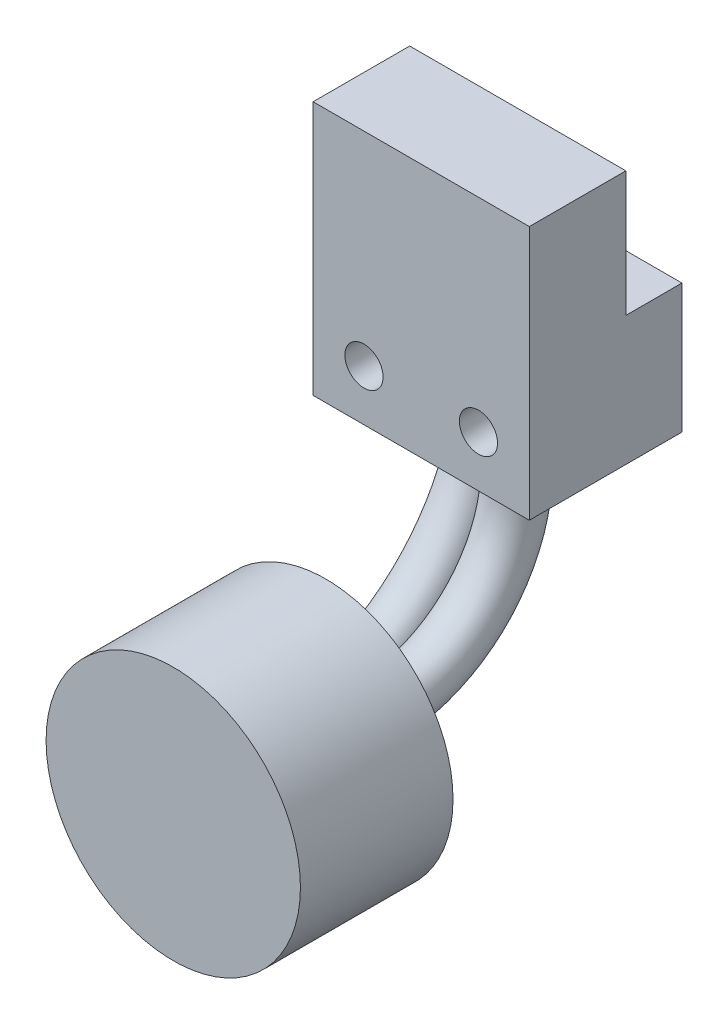
ISO-10303-21;
HEADER;
FILE_DESCRIPTION(('STEP AP214'),'2;1');
FILE_NAME('part.step','',(''),(''),'','','');
FILE_SCHEMA(('AUTOMOTIVE_DESIGN { 1 0 10303 214 1 1 1 1 }'));
ENDSEC;
DATA;
#1=APPLICATION_CONTEXT('core data for automotive mechanical design processes');
#2=APPLICATION_PROTOCOL_DEFINITION('international standard','automotive_design',2000,#1);
#3=PRODUCT_CONTEXT('',#1,'mechanical');
#4=PRODUCT('Part','Part','',(#3));
#5=PRODUCT_RELATED_PRODUCT_CATEGORY('part','',(#4));
#6=PRODUCT_DEFINITION_FORMATION('','',#4);
#7=PRODUCT_DEFINITION_CONTEXT('part definition',#1,'design');
#8=PRODUCT_DEFINITION('design','',#6,#7);
#9=PRODUCT_DEFINITION_SHAPE('','',#8);
#10=(LENGTH_UNIT() NAMED_UNIT(*) SI_UNIT(.MILLI.,.METRE.));
#11=(NAMED_UNIT(*) PLANE_ANGLE_UNIT() SI_UNIT($,.RADIAN.));
#12=(NAMED_UNIT(*) SI_UNIT($,.STERADIAN.) SOLID_ANGLE_UNIT());
#13=UNCERTAINTY_MEASURE_WITH_UNIT(LENGTH_MEASURE(1.E-05),#10,'distance_accuracy_value','');
#14=(GEOMETRIC_REPRESENTATION_CONTEXT(3) GLOBAL_UNCERTAINTY_ASSIGNED_CONTEXT((#13)) GLOBAL_UNIT_ASSIGNED_CONTEXT((#10,
#11,#12)) REPRESENTATION_CONTEXT('',''));
#15=CARTESIAN_POINT('',(0.,0.,0.));
#16=DIRECTION('',(0.,0.,1.));
#17=DIRECTION('',(1.,0.,0.));
#18=AXIS2_PLACEMENT_3D('',#15,#16,#17);
#19=CARTESIAN_POINT('',(0.,0.,60.));
#20=DIRECTION('',(0.,0.,-1.));
#21=DIRECTION('',(-1.,0.,0.));
#22=AXIS2_PLACEMENT_3D('',#19,#20,#21);
#23=CYLINDRICAL_SURFACE('',#22,50.);
#24=CARTESIAN_POINT('',(0.,0.,60.));
#25=DIRECTION('',(0.,0.,1.));
#26=DIRECTION('',(1.,0.,0.));
#27=AXIS2_PLACEMENT_3D('',#24,#25,#26);
#28=CIRCLE('',#27,50.);
#29=CARTESIAN_POINT('',(50.,0.,60.));
#30=VERTEX_POINT('',#29);
#31=EDGE_CURVE('E120',#30,#30,#28,.T.);
#32=ORIENTED_EDGE('',*,*,#31,.F.);
#33=EDGE_LOOP('',(#32));
#34=FACE_BOUND('',#33,.T.);
#35=CARTESIAN_POINT('',(0.,0.,0.));
#36=DIRECTION('',(0.,0.,1.));
#37=DIRECTION('',(1.,0.,0.));
#38=AXIS2_PLACEMENT_3D('',#35,#36,#37);
#39=CIRCLE('',#38,50.);
#40=CARTESIAN_POINT('',(50.,0.,0.));
#41=VERTEX_POINT('',#40);
#42=EDGE_CURVE('E119',#41,#41,#39,.T.);
#43=ORIENTED_EDGE('',*,*,#42,.T.);
#44=EDGE_LOOP('',(#43));
#45=FACE_BOUND('',#44,.T.);
#46=ADVANCED_FACE('F33',(#34,#45),#23,.T.);
#47=CARTESIAN_POINT('',(0.,0.,60.));
#48=DIRECTION('',(0.,0.,1.));
#49=DIRECTION('',(1.,0.,0.));
#50=AXIS2_PLACEMENT_3D('',#47,#48,#49);
#51=PLANE('',#50);
#52=ORIENTED_EDGE('',*,*,#31,.T.);
#53=EDGE_LOOP('',(#52));
#54=FACE_BOUND('',#53,.T.);
#55=ADVANCED_FACE('F136',(#54),#51,.T.);
#56=CARTESIAN_POINT('',(0.,0.,0.));
#57=DIRECTION('',(0.,0.,1.));
#58=DIRECTION('',(1.,0.,0.));
#59=AXIS2_PLACEMENT_3D('',#56,#57,#58);
#60=PLANE('',#59);
#61=CARTESIAN_POINT('',(20.,15.,0.));
#62=DIRECTION('',(0.,0.,1.));
#63=DIRECTION('',(1.,0.,0.));
#64=AXIS2_PLACEMENT_3D('',#61,#62,#63);
#65=CIRCLE('',#64,10.);
#66=CARTESIAN_POINT('',(20.,4.99999999999998,0.));
#67=VERTEX_POINT('',#66);
#68=EDGE_CURVE('E40',#67,#67,#65,.F.);
#69=ORIENTED_EDGE('',*,*,#68,.F.);
#70=EDGE_LOOP('',(#69));
#71=FACE_BOUND('',#70,.T.);
#72=CARTESIAN_POINT('',(-20.,-15.,0.));
#73=DIRECTION('',(0.,0.,1.));
#74=DIRECTION('',(1.,0.,0.));
#75=AXIS2_PLACEMENT_3D('',#72,#73,#74);
#76=CIRCLE('',#75,10.);
#77=CARTESIAN_POINT('',(-20.,-25.,0.));
#78=VERTEX_POINT('',#77);
#79=EDGE_CURVE('E123',#78,#78,#76,.F.);
#80=ORIENTED_EDGE('',*,*,#79,.F.);
#81=EDGE_LOOP('',(#80));
#82=FACE_BOUND('',#81,.T.);
#83=ORIENTED_EDGE('',*,*,#42,.F.);
#84=EDGE_LOOP('',(#83));
#85=FACE_BOUND('',#84,.T.);
#86=ADVANCED_FACE('F132',(#71,#82,#85),#60,.F.);
#87=CARTESIAN_POINT('',(-20.,70.,0.));
#88=DIRECTION('',(-1.,0.,0.));
#89=DIRECTION('',(0.,-1.,0.));
#90=AXIS2_PLACEMENT_3D('',#87,#88,#89);
#91=TOROIDAL_SURFACE('',#90,85.,10.);
#92=CARTESIAN_POINT('',(-20.,70.0000000000003,-85.));
#93=DIRECTION('',(0.,1.,0.));
#94=DIRECTION('',(-1.,0.,0.));
#95=AXIS2_PLACEMENT_3D('',#92,#93,#94);
#96=CIRCLE('',#95,10.);
#97=CARTESIAN_POINT('',(-20.,70.0000000000004,-95.));
#98=VERTEX_POINT('',#97);
#99=EDGE_CURVE('E116',#98,#98,#96,.T.);
#100=CARTESIAN_POINT('',(-20.,70.,0.));
#101=DIRECTION('',(-1.,0.,0.));
#102=DIRECTION('',(0.,-1.,0.));
#103=AXIS2_PLACEMENT_3D('',#100,#101,#102);
#104=CIRCLE('',#103,95.);
#105=EDGE_CURVE('',#98,#78,#104,.T.);
#106=ORIENTED_EDGE('',*,*,#99,.F.);
#107=ORIENTED_EDGE('',*,*,#79,.T.);
#108=ORIENTED_EDGE('',*,*,#105,.T.);
#109=ORIENTED_EDGE('',*,*,#105,.F.);
#110=EDGE_LOOP('',(#106,#108,#107,#109));
#111=FACE_BOUND('',#110,.T.);
#112=ADVANCED_FACE('F135',(#111),#91,.T.);
#113=CARTESIAN_POINT('',(20.,70.,0.));
#114=DIRECTION('',(-1.,0.,0.));
#115=DIRECTION('',(0.,-1.,0.));
#116=AXIS2_PLACEMENT_3D('',#113,#114,#115);
#117=TOROIDAL_SURFACE('',#116,55.,10.);
#118=CARTESIAN_POINT('',(20.,70.0000000000002,-55.));
#119=DIRECTION('',(0.,1.,0.));
#120=DIRECTION('',(-1.,0.,0.));
#121=AXIS2_PLACEMENT_3D('',#118,#119,#120);
#122=CIRCLE('',#121,10.);
#123=CARTESIAN_POINT('',(20.,70.0000000000003,-65.));
#124=VERTEX_POINT('',#123);
#125=EDGE_CURVE('E113',#124,#124,#122,.T.);
#126=CARTESIAN_POINT('',(20.,70.,0.));
#127=DIRECTION('',(-1.,0.,0.));
#128=DIRECTION('',(0.,-1.,0.));
#129=AXIS2_PLACEMENT_3D('',#126,#127,#128);
#130=CIRCLE('',#129,65.);
#131=EDGE_CURVE('',#124,#67,#130,.T.);
#132=ORIENTED_EDGE('',*,*,#125,.F.);
#133=ORIENTED_EDGE('',*,*,#68,.T.);
#134=ORIENTED_EDGE('',*,*,#131,.T.);
#135=ORIENTED_EDGE('',*,*,#131,.F.);
#136=EDGE_LOOP('',(#132,#134,#133,#135));
#137=FACE_BOUND('',#136,.T.);
#138=ADVANCED_FACE('F130',(#137),#117,.T.);
#139=CARTESIAN_POINT('',(40.,170.,-39.9999999999997));
#140=DIRECTION('',(-1.,0.,0.));
#141=DIRECTION('',(0.,-1.,0.));
#142=AXIS2_PLACEMENT_3D('',#139,#140,#141);
#143=PLANE('',#142);
#144=DIRECTION('',(0.,0.,1.));
#145=VECTOR('',#144,1.);
#146=CARTESIAN_POINT('',(40.,120.772365713987,-39.9999999999997));
#147=LINE('',#146,#145);
#148=CARTESIAN_POINT('',(40.,120.772365713987,-99.9999999999998));
#149=VERTEX_POINT('',#148);
#150=CARTESIAN_POINT('',(40.,120.772365713987,-77.9588302642642));
#151=VERTEX_POINT('',#150);
#152=EDGE_CURVE('E99',#149,#151,#147,.T.);
#153=ORIENTED_EDGE('',*,*,#152,.T.);
#154=DIRECTION('',(0.,1.,0.));
#155=VECTOR('',#154,1.);
#156=CARTESIAN_POINT('',(40.,170.,-77.9588302642642));
#157=LINE('',#156,#155);
#158=CARTESIAN_POINT('',(40.,170.,-77.9588302642642));
#159=VERTEX_POINT('',#158);
#160=EDGE_CURVE('E212',#151,#159,#157,.T.);
#161=ORIENTED_EDGE('',*,*,#160,.T.);
#162=DIRECTION('',(0.,0.,-1.));
#163=VECTOR('',#162,1.);
#164=CARTESIAN_POINT('',(40.,170.,-39.9999999999997));
#165=LINE('',#164,#163);
#166=CARTESIAN_POINT('',(40.,170.,-39.9999999999997));
#167=VERTEX_POINT('',#166);
#168=EDGE_CURVE('E84',#167,#159,#165,.T.);
#169=ORIENTED_EDGE('',*,*,#168,.F.);
#170=DIRECTION('',(0.,-1.,0.));
#171=VECTOR('',#170,1.);
#172=CARTESIAN_POINT('',(40.,170.,-39.9999999999997));
#173=LINE('',#172,#171);
#174=CARTESIAN_POINT('',(40.,70.0000000000001,-40.));
#175=VERTEX_POINT('',#174);
#176=EDGE_CURVE('E77',#167,#175,#173,.T.);
#177=ORIENTED_EDGE('',*,*,#176,.T.);
#178=DIRECTION('',(0.,0.,-1.));
#179=VECTOR('',#178,1.);
#180=CARTESIAN_POINT('',(40.,70.0000000000001,-40.));
#181=LINE('',#180,#179);
#182=CARTESIAN_POINT('',(40.,70.0000000000004,-100.));
#183=VERTEX_POINT('',#182);
#184=EDGE_CURVE('E92',#175,#183,#181,.T.);
#185=ORIENTED_EDGE('',*,*,#184,.T.);
#186=DIRECTION('',(0.,-1.,0.));
#187=VECTOR('',#186,1.);
#188=CARTESIAN_POINT('',(40.,170.,-99.9999999999997));
#189=LINE('',#188,#187);
#190=EDGE_CURVE('E111',#149,#183,#189,.T.);
#191=ORIENTED_EDGE('',*,*,#190,.F.);
#192=EDGE_LOOP('',(#153,#161,#169,#177,#185,#191));
#193=FACE_BOUND('',#192,.T.);
#194=ADVANCED_FACE('F90',(#193),#143,.F.);
#195=CARTESIAN_POINT('',(40.,170.,-99.9999999999997));
#196=DIRECTION('',(0.,0.,1.));
#197=DIRECTION('',(0.,-1.,0.));
#198=AXIS2_PLACEMENT_3D('',#195,#196,#197);
#199=PLANE('',#198);
#200=CARTESIAN_POINT('',(20.,90.0000000000002,-99.9999999999999));
#201=DIRECTION('',(0.,0.,1.));
#202=DIRECTION('',(0.,-1.,0.));
#203=AXIS2_PLACEMENT_3D('',#200,#201,#202);
#204=CIRCLE('',#203,7.5);
#205=CARTESIAN_POINT('',(20.,82.5000000000002,-100.));
#206=VERTEX_POINT('',#205);
#207=EDGE_CURVE('E199',#206,#206,#204,.T.);
#208=ORIENTED_EDGE('',*,*,#207,.T.);
#209=EDGE_LOOP('',(#208));
#210=FACE_BOUND('',#209,.T.);
#211=CARTESIAN_POINT('',(-25.,90.0000000000002,-99.9999999999999));
#212=DIRECTION('',(0.,0.,1.));
#213=DIRECTION('',(0.,-1.,0.));
#214=AXIS2_PLACEMENT_3D('',#211,#212,#213);
#215=CIRCLE('',#214,7.5);
#216=CARTESIAN_POINT('',(-25.,82.5000000000002,-100.));
#217=VERTEX_POINT('',#216);
#218=EDGE_CURVE('E200',#217,#217,#215,.T.);
#219=ORIENTED_EDGE('',*,*,#218,.T.);
#220=EDGE_LOOP('',(#219));
#221=FACE_BOUND('',#220,.T.);
#222=DIRECTION('',(0.,-1.,0.));
#223=VECTOR('',#222,1.);
#224=CARTESIAN_POINT('',(-45.,170.,-99.9999999999997));
#225=LINE('',#224,#223);
#226=CARTESIAN_POINT('',(-45.,120.772365713987,-100.));
#227=VERTEX_POINT('',#226);
#228=CARTESIAN_POINT('',(-45.,70.0000000000004,-100.));
#229=VERTEX_POINT('',#228);
#230=EDGE_CURVE('E109',#227,#229,#225,.T.);
#231=ORIENTED_EDGE('',*,*,#230,.F.);
#232=DIRECTION('',(1.,0.,0.));
#233=VECTOR('',#232,1.);
#234=CARTESIAN_POINT('',(40.,120.772365713987,-99.9999999999998));
#235=LINE('',#234,#233);
#236=EDGE_CURVE('E102',#227,#149,#235,.T.);
#237=ORIENTED_EDGE('',*,*,#236,.T.);
#238=ORIENTED_EDGE('',*,*,#190,.T.);
#239=DIRECTION('',(-1.,0.,0.));
#240=VECTOR('',#239,1.);
#241=CARTESIAN_POINT('',(40.,70.0000000000004,-100.));
#242=LINE('',#241,#240);
#243=EDGE_CURVE('E98',#183,#229,#242,.T.);
#244=ORIENTED_EDGE('',*,*,#243,.T.);
#245=EDGE_LOOP('',(#231,#237,#238,#244));
#246=FACE_BOUND('',#245,.T.);
#247=ADVANCED_FACE('F160',(#210,#221,#246),#199,.F.);
#248=CARTESIAN_POINT('',(-45.,170.,-39.9999999999997));
#249=DIRECTION('',(1.,0.,0.));
#250=DIRECTION('',(0.,1.,0.));
#251=AXIS2_PLACEMENT_3D('',#248,#249,#250);
#252=PLANE('',#251);
#253=DIRECTION('',(0.,0.,1.));
#254=VECTOR('',#253,1.);
#255=CARTESIAN_POINT('',(-45.,170.,-39.9999999999997));
#256=LINE('',#255,#254);
#257=CARTESIAN_POINT('',(-45.,170.,-77.9588302642642));
#258=VERTEX_POINT('',#257);
#259=CARTESIAN_POINT('',(-45.,170.,-39.9999999999997));
#260=VERTEX_POINT('',#259);
#261=EDGE_CURVE('E216',#258,#260,#256,.T.);
#262=ORIENTED_EDGE('',*,*,#261,.F.);
#263=DIRECTION('',(0.,1.,0.));
#264=VECTOR('',#263,1.);
#265=CARTESIAN_POINT('',(-45.,173.666832168753,-77.9588302642642));
#266=LINE('',#265,#264);
#267=CARTESIAN_POINT('',(-45.,120.772365713987,-77.9588302642642));
#268=VERTEX_POINT('',#267);
#269=EDGE_CURVE('E46',#268,#258,#266,.T.);
#270=ORIENTED_EDGE('',*,*,#269,.F.);
#271=DIRECTION('',(0.,0.,1.));
#272=VECTOR('',#271,1.);
#273=CARTESIAN_POINT('',(-45.,120.772365713987,-77.9588302642642));
#274=LINE('',#273,#272);
#275=EDGE_CURVE('E202',#227,#268,#274,.T.);
#276=ORIENTED_EDGE('',*,*,#275,.F.);
#277=ORIENTED_EDGE('',*,*,#230,.T.);
#278=DIRECTION('',(0.,0.,1.));
#279=VECTOR('',#278,1.);
#280=CARTESIAN_POINT('',(-45.,70.0000000000002,-40.));
#281=LINE('',#280,#279);
#282=CARTESIAN_POINT('',(-45.,70.0000000000002,-40.));
#283=VERTEX_POINT('',#282);
#284=EDGE_CURVE('E85',#229,#283,#281,.T.);
#285=ORIENTED_EDGE('',*,*,#284,.T.);
#286=DIRECTION('',(0.,-1.,0.));
#287=VECTOR('',#286,1.);
#288=CARTESIAN_POINT('',(-45.,170.,-39.9999999999997));
#289=LINE('',#288,#287);
#290=EDGE_CURVE('E80',#260,#283,#289,.T.);
#291=ORIENTED_EDGE('',*,*,#290,.F.);
#292=EDGE_LOOP('',(#262,#270,#276,#277,#285,#291));
#293=FACE_BOUND('',#292,.T.);
#294=ADVANCED_FACE('F163',(#293),#252,.F.);
#295=CARTESIAN_POINT('',(40.,170.,-39.9999999999997));
#296=DIRECTION('',(0.,0.,-1.));
#297=DIRECTION('',(0.,1.,0.));
#298=AXIS2_PLACEMENT_3D('',#295,#296,#297);
#299=PLANE('',#298);
#300=CARTESIAN_POINT('',(20.,90.0000000000002,-40.0000000000003));
#301=DIRECTION('',(0.,0.,1.));
#302=DIRECTION('',(1.,0.,0.));
#303=AXIS2_PLACEMENT_3D('',#300,#301,#302);
#304=CIRCLE('',#303,7.5);
#305=CARTESIAN_POINT('',(27.5,90.0000000000002,-40.0000000000003));
#306=VERTEX_POINT('',#305);
#307=EDGE_CURVE('E196',#306,#306,#304,.T.);
#308=ORIENTED_EDGE('',*,*,#307,.F.);
#309=EDGE_LOOP('',(#308));
#310=FACE_BOUND('',#309,.T.);
#311=CARTESIAN_POINT('',(-25.,90.0000000000002,-40.0000000000003));
#312=DIRECTION('',(0.,0.,1.));
#313=DIRECTION('',(1.,0.,0.));
#314=AXIS2_PLACEMENT_3D('',#311,#312,#313);
#315=CIRCLE('',#314,7.5);
#316=CARTESIAN_POINT('',(-17.5,90.0000000000002,-40.0000000000003));
#317=VERTEX_POINT('',#316);
#318=EDGE_CURVE('E233',#317,#317,#315,.T.);
#319=ORIENTED_EDGE('',*,*,#318,.F.);
#320=EDGE_LOOP('',(#319));
#321=FACE_BOUND('',#320,.T.);
#322=DIRECTION('',(1.,0.,0.));
#323=VECTOR('',#322,1.);
#324=CARTESIAN_POINT('',(40.,70.0000000000001,-40.));
#325=LINE('',#324,#323);
#326=EDGE_CURVE('E74',#283,#175,#325,.T.);
#327=ORIENTED_EDGE('',*,*,#326,.T.);
#328=ORIENTED_EDGE('',*,*,#176,.F.);
#329=DIRECTION('',(1.,0.,0.));
#330=VECTOR('',#329,1.);
#331=CARTESIAN_POINT('',(40.,170.,-39.9999999999997));
#332=LINE('',#331,#330);
#333=EDGE_CURVE('E55',#260,#167,#332,.T.);
#334=ORIENTED_EDGE('',*,*,#333,.F.);
#335=ORIENTED_EDGE('',*,*,#290,.T.);
#336=EDGE_LOOP('',(#327,#328,#334,#335));
#337=FACE_BOUND('',#336,.T.);
#338=ADVANCED_FACE('F76',(#310,#321,#337),#299,.F.);
#339=CARTESIAN_POINT('',(0.,170.,6.08200172963517E-13));
#340=DIRECTION('',(0.,1.,0.));
#341=DIRECTION('',(0.,0.,1.));
#342=AXIS2_PLACEMENT_3D('',#339,#340,#341);
#343=PLANE('',#342);
#344=DIRECTION('',(1.,0.,0.));
#345=VECTOR('',#344,1.);
#346=CARTESIAN_POINT('',(0.,170.,-77.9588302642642));
#347=LINE('',#346,#345);
#348=EDGE_CURVE('E11',#258,#159,#347,.T.);
#349=ORIENTED_EDGE('',*,*,#348,.F.);
#350=ORIENTED_EDGE('',*,*,#261,.T.);
#351=ORIENTED_EDGE('',*,*,#333,.T.);
#352=ORIENTED_EDGE('',*,*,#168,.T.);
#353=EDGE_LOOP('',(#349,#350,#351,#352));
#354=FACE_BOUND('',#353,.T.);
#355=ADVANCED_FACE('F170',(#354),#343,.T.);
#356=CARTESIAN_POINT('',(0.,70.,2.59052039079203E-13));
#357=DIRECTION('',(0.,1.,0.));
#358=DIRECTION('',(0.,0.,1.));
#359=AXIS2_PLACEMENT_3D('',#356,#357,#358);
#360=PLANE('',#359);
#361=ORIENTED_EDGE('',*,*,#99,.T.);
#362=EDGE_LOOP('',(#361));
#363=FACE_BOUND('',#362,.T.);
#364=ORIENTED_EDGE('',*,*,#125,.T.);
#365=EDGE_LOOP('',(#364));
#366=FACE_BOUND('',#365,.T.);
#367=ORIENTED_EDGE('',*,*,#184,.F.);
#368=ORIENTED_EDGE('',*,*,#326,.F.);
#369=ORIENTED_EDGE('',*,*,#284,.F.);
#370=ORIENTED_EDGE('',*,*,#243,.F.);
#371=EDGE_LOOP('',(#367,#368,#369,#370));
#372=FACE_BOUND('',#371,.T.);
#373=ADVANCED_FACE('F96',(#363,#366,#372),#360,.F.);
#374=CARTESIAN_POINT('',(55.,120.772365713987,-77.9588302642642));
#375=DIRECTION('',(0.,-1.,0.));
#376=DIRECTION('',(1.,0.,0.));
#377=AXIS2_PLACEMENT_3D('',#374,#375,#376);
#378=PLANE('',#377);
#379=ORIENTED_EDGE('',*,*,#236,.F.);
#380=ORIENTED_EDGE('',*,*,#275,.T.);
#381=DIRECTION('',(-1.,0.,0.));
#382=VECTOR('',#381,1.);
#383=CARTESIAN_POINT('',(55.,120.772365713987,-77.9588302642642));
#384=LINE('',#383,#382);
#385=EDGE_CURVE('E210',#151,#268,#384,.T.);
#386=ORIENTED_EDGE('',*,*,#385,.F.);
#387=ORIENTED_EDGE('',*,*,#152,.F.);
#388=EDGE_LOOP('',(#379,#380,#386,#387));
#389=FACE_BOUND('',#388,.T.);
#390=ADVANCED_FACE('F174',(#389),#378,.F.);
#391=CARTESIAN_POINT('',(55.,173.666832168753,-77.9588302642642));
#392=DIRECTION('',(0.,0.,1.));
#393=DIRECTION('',(1.,0.,0.));
#394=AXIS2_PLACEMENT_3D('',#391,#392,#393);
#395=PLANE('',#394);
#396=ORIENTED_EDGE('',*,*,#385,.T.);
#397=ORIENTED_EDGE('',*,*,#269,.T.);
#398=ORIENTED_EDGE('',*,*,#348,.T.);
#399=ORIENTED_EDGE('',*,*,#160,.F.);
#400=EDGE_LOOP('',(#396,#397,#398,#399));
#401=FACE_BOUND('',#400,.T.);
#402=ADVANCED_FACE('F178',(#401),#395,.F.);
#403=CARTESIAN_POINT('',(-25.,90.0000000000002,-140.));
#404=DIRECTION('',(0.,0.,1.));
#405=DIRECTION('',(1.,0.,0.));
#406=AXIS2_PLACEMENT_3D('',#403,#404,#405);
#407=CYLINDRICAL_SURFACE('',#406,7.5);
#408=ORIENTED_EDGE('',*,*,#318,.T.);
#409=EDGE_LOOP('',(#408));
#410=FACE_BOUND('',#409,.T.);
#411=ORIENTED_EDGE('',*,*,#218,.F.);
#412=EDGE_LOOP('',(#411));
#413=FACE_BOUND('',#412,.T.);
#414=ADVANCED_FACE('F181',(#410,#413),#407,.F.);
#415=CARTESIAN_POINT('',(20.,90.0000000000002,-140.));
#416=DIRECTION('',(0.,0.,1.));
#417=DIRECTION('',(1.,0.,0.));
#418=AXIS2_PLACEMENT_3D('',#415,#416,#417);
#419=CYLINDRICAL_SURFACE('',#418,7.5);
#420=ORIENTED_EDGE('',*,*,#307,.T.);
#421=EDGE_LOOP('',(#420));
#422=FACE_BOUND('',#421,.T.);
#423=ORIENTED_EDGE('',*,*,#207,.F.);
#424=EDGE_LOOP('',(#423));
#425=FACE_BOUND('',#424,.T.);
#426=ADVANCED_FACE('F187',(#422,#425),#419,.F.);
#427=CLOSED_SHELL('',(#46,#55,#86,#112,#138,#194,#247,#294,#338,#355,#373,#390,#402,#414,#426));
#428=MANIFOLD_SOLID_BREP('B2',#427);
#429=ADVANCED_BREP_SHAPE_REPRESENTATION('',(#18,#428),#14);
#430=SHAPE_DEFINITION_REPRESENTATION(#9,#429);
ENDSEC;
END-ISO-10303-21;
